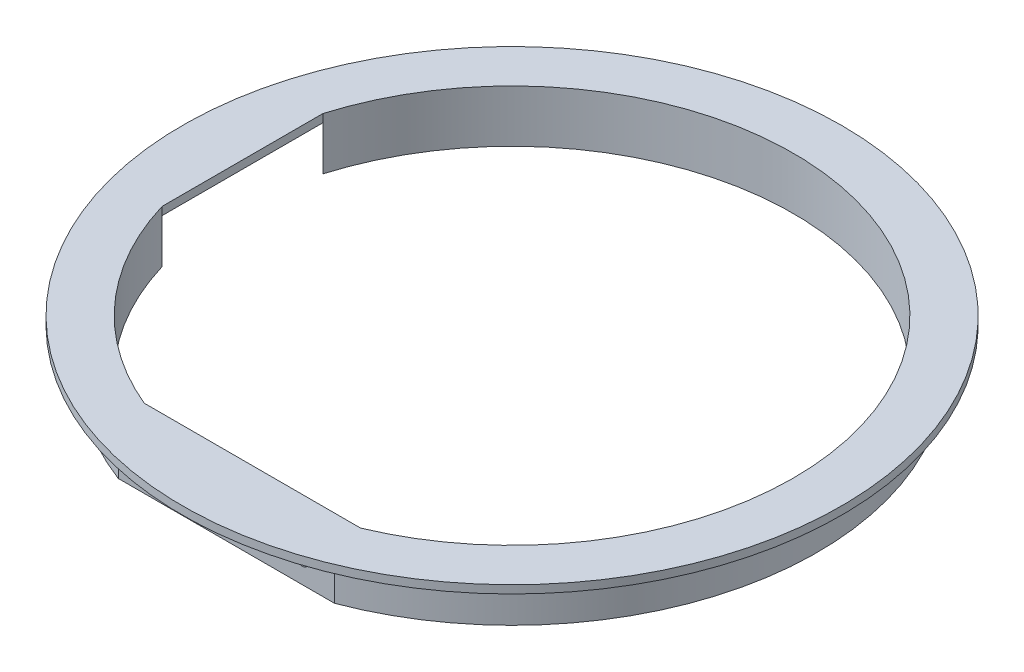
ISO-10303-21;
HEADER;
FILE_DESCRIPTION(('STEP AP214'),'2;1');
FILE_NAME('part.step','',(''),(''),'','','');
FILE_SCHEMA(('AUTOMOTIVE_DESIGN { 1 0 10303 214 1 1 1 1 }'));
ENDSEC;
DATA;
#1=APPLICATION_CONTEXT('core data for automotive mechanical design processes');
#2=APPLICATION_PROTOCOL_DEFINITION('international standard','automotive_design',2000,#1);
#3=PRODUCT_CONTEXT('',#1,'mechanical');
#4=PRODUCT('Part','Part','',(#3));
#5=PRODUCT_RELATED_PRODUCT_CATEGORY('part','',(#4));
#6=PRODUCT_DEFINITION_FORMATION('','',#4);
#7=PRODUCT_DEFINITION_CONTEXT('part definition',#1,'design');
#8=PRODUCT_DEFINITION('design','',#6,#7);
#9=PRODUCT_DEFINITION_SHAPE('','',#8);
#10=(LENGTH_UNIT() NAMED_UNIT(*) SI_UNIT(.MILLI.,.METRE.));
#11=(NAMED_UNIT(*) PLANE_ANGLE_UNIT() SI_UNIT($,.RADIAN.));
#12=(NAMED_UNIT(*) SI_UNIT($,.STERADIAN.) SOLID_ANGLE_UNIT());
#13=UNCERTAINTY_MEASURE_WITH_UNIT(LENGTH_MEASURE(1.E-05),#10,'distance_accuracy_value','');
#14=(GEOMETRIC_REPRESENTATION_CONTEXT(3) GLOBAL_UNCERTAINTY_ASSIGNED_CONTEXT((#13)) GLOBAL_UNIT_ASSIGNED_CONTEXT((#10,
#11,#12)) REPRESENTATION_CONTEXT('',''));
#15=CARTESIAN_POINT('',(0.,0.,0.));
#16=DIRECTION('',(0.,0.,1.));
#17=DIRECTION('',(1.,0.,0.));
#18=AXIS2_PLACEMENT_3D('',#15,#16,#17);
#19=CARTESIAN_POINT('',(-13.4536240470737,-0.999999999999997,35.5387112878337));
#20=DIRECTION('',(0.,0.,-1.));
#21=DIRECTION('',(-1.,0.,0.));
#22=AXIS2_PLACEMENT_3D('',#19,#20,#21);
#23=PLANE('',#22);
#24=CARTESIAN_POINT('',(9.45362404707372,-3.75,35.5387112878337));
#25=DIRECTION('',(0.,0.,1.));
#26=DIRECTION('',(1.,0.,0.));
#27=AXIS2_PLACEMENT_3D('',#24,#25,#26);
#28=CIRCLE('',#27,0.749999999999987);
#29=CARTESIAN_POINT('',(10.2036240470737,-3.75,35.5387112878337));
#30=VERTEX_POINT('',#29);
#31=EDGE_CURVE('E233',#30,#30,#28,.T.);
#32=ORIENTED_EDGE('',*,*,#31,.F.);
#33=EDGE_LOOP('',(#32));
#34=FACE_BOUND('',#33,.T.);
#35=CARTESIAN_POINT('',(5.45362404707372,-3.75,35.5387112878337));
#36=DIRECTION('',(0.,0.,1.));
#37=DIRECTION('',(1.,0.,0.));
#38=AXIS2_PLACEMENT_3D('',#35,#36,#37);
#39=CIRCLE('',#38,0.749999999999987);
#40=CARTESIAN_POINT('',(6.20362404707371,-3.75,35.5387112878337));
#41=VERTEX_POINT('',#40);
#42=EDGE_CURVE('E239',#41,#41,#39,.T.);
#43=ORIENTED_EDGE('',*,*,#42,.F.);
#44=EDGE_LOOP('',(#43));
#45=FACE_BOUND('',#44,.T.);
#46=CARTESIAN_POINT('',(-5.45362404707373,-3.75,35.5387112878337));
#47=DIRECTION('',(0.,0.,1.));
#48=DIRECTION('',(1.,0.,0.));
#49=AXIS2_PLACEMENT_3D('',#46,#47,#48);
#50=CIRCLE('',#49,0.749999999999987);
#51=CARTESIAN_POINT('',(-4.70362404707375,-3.75,35.5387112878337));
#52=VERTEX_POINT('',#51);
#53=EDGE_CURVE('E245',#52,#52,#50,.T.);
#54=ORIENTED_EDGE('',*,*,#53,.F.);
#55=EDGE_LOOP('',(#54));
#56=FACE_BOUND('',#55,.T.);
#57=DIRECTION('',(0.,-1.,0.));
#58=VECTOR('',#57,1.);
#59=CARTESIAN_POINT('',(13.4536240470737,-0.999999999999997,35.5387112878337));
#60=LINE('',#59,#58);
#61=CARTESIAN_POINT('',(13.4536240470737,-2.,35.5387112878337));
#62=VERTEX_POINT('',#61);
#63=CARTESIAN_POINT('',(13.4536240470737,-6.5,35.5387112878337));
#64=VERTEX_POINT('',#63);
#65=EDGE_CURVE('E156',#62,#64,#60,.T.);
#66=ORIENTED_EDGE('',*,*,#65,.F.);
#67=DIRECTION('',(1.,0.,0.));
#68=VECTOR('',#67,1.);
#69=CARTESIAN_POINT('',(-13.4536240470737,-2.,35.5387112878337));
#70=LINE('',#69,#68);
#71=CARTESIAN_POINT('',(-13.4536240470737,-2.,35.5387112878337));
#72=VERTEX_POINT('',#71);
#73=EDGE_CURVE('E188',#62,#72,#70,.F.);
#74=ORIENTED_EDGE('',*,*,#73,.T.);
#75=DIRECTION('',(0.,-1.,0.));
#76=VECTOR('',#75,1.);
#77=CARTESIAN_POINT('',(-13.4536240470737,-0.999999999999997,35.5387112878337));
#78=LINE('',#77,#76);
#79=CARTESIAN_POINT('',(-13.4536240470737,-6.5,35.5387112878337));
#80=VERTEX_POINT('',#79);
#81=EDGE_CURVE('E269',#72,#80,#78,.T.);
#82=ORIENTED_EDGE('',*,*,#81,.T.);
#83=DIRECTION('',(1.,0.,0.));
#84=VECTOR('',#83,1.);
#85=CARTESIAN_POINT('',(-13.4536240470737,-6.5,35.5387112878337));
#86=LINE('',#85,#84);
#87=EDGE_CURVE('E266',#80,#64,#86,.T.);
#88=ORIENTED_EDGE('',*,*,#87,.T.);
#89=EDGE_LOOP('',(#66,#74,#82,#88));
#90=FACE_BOUND('',#89,.T.);
#91=CARTESIAN_POINT('',(-9.45362404707373,-3.75,35.5387112878337));
#92=DIRECTION('',(0.,0.,1.));
#93=DIRECTION('',(1.,0.,0.));
#94=AXIS2_PLACEMENT_3D('',#91,#92,#93);
#95=CIRCLE('',#94,0.749999999999987);
#96=CARTESIAN_POINT('',(-8.70362404707375,-3.75,35.5387112878337));
#97=VERTEX_POINT('',#96);
#98=EDGE_CURVE('E251',#97,#97,#95,.T.);
#99=ORIENTED_EDGE('',*,*,#98,.F.);
#100=EDGE_LOOP('',(#99));
#101=FACE_BOUND('',#100,.T.);
#102=ADVANCED_FACE('F33',(#34,#45,#56,#90,#101),#23,.F.);
#103=CARTESIAN_POINT('',(0.,-6.5,0.));
#104=DIRECTION('',(0.,-1.,0.));
#105=DIRECTION('',(0.,0.,-1.));
#106=AXIS2_PLACEMENT_3D('',#103,#104,#105);
#107=CYLINDRICAL_SURFACE('',#106,38.);
#108=ORIENTED_EDGE('',*,*,#81,.F.);
#109=CARTESIAN_POINT('',(0.,-2.,0.));
#110=DIRECTION('',(0.,-1.,0.));
#111=DIRECTION('',(0.,0.,-1.));
#112=AXIS2_PLACEMENT_3D('',#109,#110,#111);
#113=CIRCLE('',#112,38.);
#114=CARTESIAN_POINT('',(-36.6606055596467,-2.,10.));
#115=VERTEX_POINT('',#114);
#116=EDGE_CURVE('E178',#72,#115,#113,.T.);
#117=ORIENTED_EDGE('',*,*,#116,.T.);
#118=DIRECTION('',(0.,-1.,0.));
#119=VECTOR('',#118,1.);
#120=CARTESIAN_POINT('',(-36.6606055596467,-0.999999999999997,10.));
#121=LINE('',#120,#119);
#122=CARTESIAN_POINT('',(-36.6606055596467,-6.5,10.));
#123=VERTEX_POINT('',#122);
#124=EDGE_CURVE('E264',#115,#123,#121,.T.);
#125=ORIENTED_EDGE('',*,*,#124,.T.);
#126=CARTESIAN_POINT('',(0.,-6.5,0.));
#127=DIRECTION('',(0.,-1.,0.));
#128=DIRECTION('',(0.,0.,-1.));
#129=AXIS2_PLACEMENT_3D('',#126,#127,#128);
#130=CIRCLE('',#129,38.);
#131=EDGE_CURVE('E169',#80,#123,#130,.T.);
#132=ORIENTED_EDGE('',*,*,#131,.F.);
#133=EDGE_LOOP('',(#108,#117,#125,#132));
#134=FACE_BOUND('',#133,.T.);
#135=ADVANCED_FACE('F294',(#134),#107,.T.);
#136=CARTESIAN_POINT('',(0.,0.,0.));
#137=DIRECTION('',(0.,1.,0.));
#138=DIRECTION('',(0.,0.,1.));
#139=AXIS2_PLACEMENT_3D('',#136,#137,#138);
#140=PLANE('',#139);
#141=CARTESIAN_POINT('',(0.,0.,0.));
#142=DIRECTION('',(0.,1.,0.));
#143=DIRECTION('',(0.,0.,1.));
#144=AXIS2_PLACEMENT_3D('',#141,#142,#143);
#145=CIRCLE('',#144,35.);
#146=CARTESIAN_POINT('',(-33.5410196624969,0.,10.));
#147=VERTEX_POINT('',#146);
#148=CARTESIAN_POINT('',(-13.4536240470737,0.,32.310988842807));
#149=VERTEX_POINT('',#148);
#150=EDGE_CURVE('E153',#147,#149,#145,.T.);
#151=ORIENTED_EDGE('',*,*,#150,.F.);
#152=DIRECTION('',(0.,0.,1.));
#153=VECTOR('',#152,1.);
#154=CARTESIAN_POINT('',(-33.5410196624969,0.,-10.));
#155=LINE('',#154,#153);
#156=CARTESIAN_POINT('',(-33.5410196624969,0.,-10.));
#157=VERTEX_POINT('',#156);
#158=EDGE_CURVE('E161',#157,#147,#155,.T.);
#159=ORIENTED_EDGE('',*,*,#158,.F.);
#160=CARTESIAN_POINT('',(0.,0.,0.));
#161=DIRECTION('',(0.,1.,0.));
#162=DIRECTION('',(0.,0.,1.));
#163=AXIS2_PLACEMENT_3D('',#160,#161,#162);
#164=CIRCLE('',#163,35.);
#165=CARTESIAN_POINT('',(13.4536240470737,0.,32.310988842807));
#166=VERTEX_POINT('',#165);
#167=EDGE_CURVE('E159',#166,#157,#164,.T.);
#168=ORIENTED_EDGE('',*,*,#167,.F.);
#169=DIRECTION('',(1.,0.,0.));
#170=VECTOR('',#169,1.);
#171=CARTESIAN_POINT('',(-13.4536240470737,0.,32.310988842807));
#172=LINE('',#171,#170);
#173=EDGE_CURVE('E155',#149,#166,#172,.T.);
#174=ORIENTED_EDGE('',*,*,#173,.F.);
#175=EDGE_LOOP('',(#151,#159,#168,#174));
#176=FACE_BOUND('',#175,.T.);
#177=CARTESIAN_POINT('',(0.,0.,0.));
#178=DIRECTION('',(0.,-1.,0.));
#179=DIRECTION('',(0.,0.,-1.));
#180=AXIS2_PLACEMENT_3D('',#177,#178,#179);
#181=CIRCLE('',#180,41.);
#182=CARTESIAN_POINT('',(0.,0.,-41.));
#183=VERTEX_POINT('',#182);
#184=EDGE_CURVE('E175',#183,#183,#181,.T.);
#185=ORIENTED_EDGE('',*,*,#184,.F.);
#186=EDGE_LOOP('',(#185));
#187=FACE_BOUND('',#186,.T.);
#188=ADVANCED_FACE('F211',(#176,#187),#140,.T.);
#189=CARTESIAN_POINT('',(0.,-6.5,0.));
#190=DIRECTION('',(0.,-1.,0.));
#191=DIRECTION('',(0.,0.,-1.));
#192=AXIS2_PLACEMENT_3D('',#189,#190,#191);
#193=CYLINDRICAL_SURFACE('',#192,41.);
#194=ORIENTED_EDGE('',*,*,#184,.T.);
#195=EDGE_LOOP('',(#194));
#196=FACE_BOUND('',#195,.T.);
#197=CARTESIAN_POINT('',(0.,-1.,0.));
#198=DIRECTION('',(0.,-1.,0.));
#199=DIRECTION('',(0.,0.,-1.));
#200=AXIS2_PLACEMENT_3D('',#197,#198,#199);
#201=CIRCLE('',#200,41.);
#202=CARTESIAN_POINT('',(0.,-1.,-41.));
#203=VERTEX_POINT('',#202);
#204=EDGE_CURVE('E172',#203,#203,#201,.T.);
#205=ORIENTED_EDGE('',*,*,#204,.F.);
#206=EDGE_LOOP('',(#205));
#207=FACE_BOUND('',#206,.T.);
#208=ADVANCED_FACE('F330',(#196,#207),#193,.T.);
#209=CARTESIAN_POINT('',(0.,-1.,-41.));
#210=DIRECTION('',(0.,-1.,0.));
#211=DIRECTION('',(0.,0.,-1.));
#212=AXIS2_PLACEMENT_3D('',#209,#210,#211);
#213=PLANE('',#212);
#214=DIRECTION('',(-1.,0.,0.));
#215=VECTOR('',#214,1.);
#216=CARTESIAN_POINT('',(-26.6606055596467,-0.999999999999997,10.));
#217=LINE('',#216,#215);
#218=CARTESIAN_POINT('',(-33.5410196624969,-0.999999999999997,10.));
#219=VERTEX_POINT('',#218);
#220=CARTESIAN_POINT('',(-37.6961536499415,-1.,10.));
#221=VERTEX_POINT('',#220);
#222=EDGE_CURVE('E257',#219,#221,#217,.T.);
#223=ORIENTED_EDGE('',*,*,#222,.T.);
#224=CARTESIAN_POINT('',(0.,-1.,0.));
#225=DIRECTION('',(0.,-1.,0.));
#226=DIRECTION('',(0.,0.,-1.));
#227=AXIS2_PLACEMENT_3D('',#224,#225,#226);
#228=CIRCLE('',#227,39.);
#229=CARTESIAN_POINT('',(-13.6353429522082,-1.,36.5387112878337));
#230=VERTEX_POINT('',#229);
#231=EDGE_CURVE('E186',#221,#230,#228,.F.);
#232=ORIENTED_EDGE('',*,*,#231,.T.);
#233=DIRECTION('',(1.,0.,0.));
#234=VECTOR('',#233,1.);
#235=CARTESIAN_POINT('',(0.,-1.,36.5387112878337));
#236=LINE('',#235,#234);
#237=CARTESIAN_POINT('',(13.6353429522082,-1.,36.5387112878337));
#238=VERTEX_POINT('',#237);
#239=EDGE_CURVE('E184',#230,#238,#236,.T.);
#240=ORIENTED_EDGE('',*,*,#239,.T.);
#241=CARTESIAN_POINT('',(0.,-1.,0.));
#242=DIRECTION('',(0.,-1.,0.));
#243=DIRECTION('',(0.,0.,-1.));
#244=AXIS2_PLACEMENT_3D('',#241,#242,#243);
#245=CIRCLE('',#244,39.);
#246=CARTESIAN_POINT('',(-33.5410196624969,-0.999999999999997,-19.8997487421324));
#247=VERTEX_POINT('',#246);
#248=EDGE_CURVE('E181',#238,#247,#245,.F.);
#249=ORIENTED_EDGE('',*,*,#248,.T.);
#250=DIRECTION('',(0.,0.,1.));
#251=VECTOR('',#250,1.);
#252=CARTESIAN_POINT('',(-33.5410196624969,-0.999999999999997,-41.));
#253=LINE('',#252,#251);
#254=CARTESIAN_POINT('',(-33.5410196624969,-0.999999999999997,-10.));
#255=VERTEX_POINT('',#254);
#256=EDGE_CURVE('E128',#247,#255,#253,.T.);
#257=ORIENTED_EDGE('',*,*,#256,.T.);
#258=DIRECTION('',(0.,0.,-1.));
#259=VECTOR('',#258,1.);
#260=CARTESIAN_POINT('',(-33.5410196624969,-0.999999999999997,-10.));
#261=LINE('',#260,#259);
#262=EDGE_CURVE('E261',#219,#255,#261,.T.);
#263=ORIENTED_EDGE('',*,*,#262,.F.);
#264=EDGE_LOOP('',(#223,#232,#240,#249,#257,#263));
#265=FACE_BOUND('',#264,.T.);
#266=ORIENTED_EDGE('',*,*,#204,.T.);
#267=EDGE_LOOP('',(#266));
#268=FACE_BOUND('',#267,.T.);
#269=ADVANCED_FACE('F287',(#265,#268),#213,.T.);
#270=DIRECTION('',(0.,-1.,0.));
#271=VECTOR('',#270,1.);
#272=CARTESIAN_POINT('',(-33.5410196624969,-6.5,-17.8605710994917));
#273=LINE('',#272,#271);
#274=CARTESIAN_POINT('',(-33.5410196624969,-2.,-17.8605710994917));
#275=VERTEX_POINT('',#274);
#276=CARTESIAN_POINT('',(-33.5410196624969,-6.5,-17.8605710994917));
#277=VERTEX_POINT('',#276);
#278=EDGE_CURVE('E123',#275,#277,#273,.T.);
#279=ORIENTED_EDGE('',*,*,#278,.F.);
#280=CARTESIAN_POINT('',(0.,-2.,0.));
#281=DIRECTION('',(0.,-1.,0.));
#282=DIRECTION('',(0.,0.,-1.));
#283=AXIS2_PLACEMENT_3D('',#280,#281,#282);
#284=CIRCLE('',#283,38.);
#285=EDGE_CURVE('E59',#275,#62,#284,.T.);
#286=ORIENTED_EDGE('',*,*,#285,.T.);
#287=ORIENTED_EDGE('',*,*,#65,.T.);
#288=EDGE_CURVE('E166',#277,#64,#130,.T.);
#289=ORIENTED_EDGE('',*,*,#288,.F.);
#290=EDGE_LOOP('',(#279,#286,#287,#289));
#291=FACE_BOUND('',#290,.T.);
#292=ADVANCED_FACE('F299',(#291),#107,.T.);
#293=CARTESIAN_POINT('',(0.,-6.5,-38.));
#294=DIRECTION('',(0.,-1.,0.));
#295=DIRECTION('',(0.,0.,-1.));
#296=AXIS2_PLACEMENT_3D('',#293,#294,#295);
#297=PLANE('',#296);
#298=DIRECTION('',(0.,0.,1.));
#299=VECTOR('',#298,1.);
#300=CARTESIAN_POINT('',(-33.5410196624969,-6.5,-41.));
#301=LINE('',#300,#299);
#302=CARTESIAN_POINT('',(-33.5410196624969,-6.5,-10.));
#303=VERTEX_POINT('',#302);
#304=EDGE_CURVE('E118',#277,#303,#301,.T.);
#305=ORIENTED_EDGE('',*,*,#304,.F.);
#306=ORIENTED_EDGE('',*,*,#288,.T.);
#307=ORIENTED_EDGE('',*,*,#87,.F.);
#308=ORIENTED_EDGE('',*,*,#131,.T.);
#309=DIRECTION('',(-1.,0.,0.));
#310=VECTOR('',#309,1.);
#311=CARTESIAN_POINT('',(-26.6606055596467,-6.5,10.));
#312=LINE('',#311,#310);
#313=CARTESIAN_POINT('',(-33.5410196624969,-6.5,10.));
#314=VERTEX_POINT('',#313);
#315=EDGE_CURVE('E258',#314,#123,#312,.T.);
#316=ORIENTED_EDGE('',*,*,#315,.F.);
#317=CARTESIAN_POINT('',(0.,-6.5,0.));
#318=DIRECTION('',(0.,1.,0.));
#319=DIRECTION('',(0.,0.,1.));
#320=AXIS2_PLACEMENT_3D('',#317,#318,#319);
#321=CIRCLE('',#320,35.);
#322=CARTESIAN_POINT('',(-13.4536240470737,-6.5,32.310988842807));
#323=VERTEX_POINT('',#322);
#324=EDGE_CURVE('E149',#314,#323,#321,.T.);
#325=ORIENTED_EDGE('',*,*,#324,.T.);
#326=DIRECTION('',(1.,0.,0.));
#327=VECTOR('',#326,1.);
#328=CARTESIAN_POINT('',(-13.4536240470737,-6.5,32.310988842807));
#329=LINE('',#328,#327);
#330=CARTESIAN_POINT('',(13.4536240470737,-6.5,32.310988842807));
#331=VERTEX_POINT('',#330);
#332=EDGE_CURVE('E143',#323,#331,#329,.T.);
#333=ORIENTED_EDGE('',*,*,#332,.T.);
#334=CARTESIAN_POINT('',(0.,-6.5,0.));
#335=DIRECTION('',(0.,1.,0.));
#336=DIRECTION('',(0.,0.,1.));
#337=AXIS2_PLACEMENT_3D('',#334,#335,#336);
#338=CIRCLE('',#337,35.);
#339=EDGE_CURVE('E134',#331,#303,#338,.T.);
#340=ORIENTED_EDGE('',*,*,#339,.T.);
#341=EDGE_LOOP('',(#305,#306,#307,#308,#316,#325,#333,#340));
#342=FACE_BOUND('',#341,.T.);
#343=ADVANCED_FACE('F140',(#342),#297,.T.);
#344=CARTESIAN_POINT('',(0.,-6.5,0.));
#345=DIRECTION('',(0.,1.,0.));
#346=DIRECTION('',(0.,0.,1.));
#347=AXIS2_PLACEMENT_3D('',#344,#345,#346);
#348=CYLINDRICAL_SURFACE('',#347,35.);
#349=ORIENTED_EDGE('',*,*,#150,.T.);
#350=DIRECTION('',(0.,1.,0.));
#351=VECTOR('',#350,1.);
#352=CARTESIAN_POINT('',(-13.4536240470737,-6.5,32.310988842807));
#353=LINE('',#352,#351);
#354=EDGE_CURVE('E144',#323,#149,#353,.T.);
#355=ORIENTED_EDGE('',*,*,#354,.F.);
#356=ORIENTED_EDGE('',*,*,#324,.F.);
#357=DIRECTION('',(0.,1.,0.));
#358=VECTOR('',#357,1.);
#359=CARTESIAN_POINT('',(-33.5410196624969,-6.5,10.));
#360=LINE('',#359,#358);
#361=EDGE_CURVE('E164',#314,#219,#360,.T.);
#362=ORIENTED_EDGE('',*,*,#361,.T.);
#363=EDGE_CURVE('E137',#219,#147,#360,.T.);
#364=ORIENTED_EDGE('',*,*,#363,.T.);
#365=EDGE_LOOP('',(#349,#355,#356,#362,#364));
#366=FACE_BOUND('',#365,.T.);
#367=ADVANCED_FACE('F274',(#366),#348,.F.);
#368=CARTESIAN_POINT('',(-33.5410196624969,-6.5,-10.));
#369=DIRECTION('',(-1.,0.,0.));
#370=DIRECTION('',(0.,0.,1.));
#371=AXIS2_PLACEMENT_3D('',#368,#369,#370);
#372=PLANE('',#371);
#373=ORIENTED_EDGE('',*,*,#363,.F.);
#374=ORIENTED_EDGE('',*,*,#262,.T.);
#375=DIRECTION('',(0.,1.,0.));
#376=VECTOR('',#375,1.);
#377=CARTESIAN_POINT('',(-33.5410196624969,-6.5,-10.));
#378=LINE('',#377,#376);
#379=EDGE_CURVE('E136',#255,#157,#378,.T.);
#380=ORIENTED_EDGE('',*,*,#379,.T.);
#381=ORIENTED_EDGE('',*,*,#158,.T.);
#382=EDGE_LOOP('',(#373,#374,#380,#381));
#383=FACE_BOUND('',#382,.T.);
#384=ADVANCED_FACE('F285',(#383),#372,.F.);
#385=CARTESIAN_POINT('',(0.,-6.5,0.));
#386=DIRECTION('',(0.,1.,0.));
#387=DIRECTION('',(0.,0.,1.));
#388=AXIS2_PLACEMENT_3D('',#385,#386,#387);
#389=CYLINDRICAL_SURFACE('',#388,35.);
#390=ORIENTED_EDGE('',*,*,#167,.T.);
#391=ORIENTED_EDGE('',*,*,#379,.F.);
#392=EDGE_CURVE('E121',#303,#255,#378,.T.);
#393=ORIENTED_EDGE('',*,*,#392,.F.);
#394=ORIENTED_EDGE('',*,*,#339,.F.);
#395=DIRECTION('',(0.,1.,0.));
#396=VECTOR('',#395,1.);
#397=CARTESIAN_POINT('',(13.4536240470737,-6.5,32.310988842807));
#398=LINE('',#397,#396);
#399=EDGE_CURVE('E147',#331,#166,#398,.T.);
#400=ORIENTED_EDGE('',*,*,#399,.T.);
#401=EDGE_LOOP('',(#390,#391,#393,#394,#400));
#402=FACE_BOUND('',#401,.T.);
#403=ADVANCED_FACE('F133',(#402),#389,.F.);
#404=CARTESIAN_POINT('',(-13.4536240470737,-6.5,32.310988842807));
#405=DIRECTION('',(0.,0.,1.));
#406=DIRECTION('',(1.,0.,0.));
#407=AXIS2_PLACEMENT_3D('',#404,#405,#406);
#408=PLANE('',#407);
#409=CARTESIAN_POINT('',(9.45362404707372,-3.75,32.310988842807));
#410=DIRECTION('',(0.,0.,1.));
#411=DIRECTION('',(1.,0.,0.));
#412=AXIS2_PLACEMENT_3D('',#409,#410,#411);
#413=CIRCLE('',#412,0.749999999999993);
#414=CARTESIAN_POINT('',(10.2036240470737,-3.75,32.310988842807));
#415=VERTEX_POINT('',#414);
#416=EDGE_CURVE('E236',#415,#415,#413,.T.);
#417=ORIENTED_EDGE('',*,*,#416,.T.);
#418=EDGE_LOOP('',(#417));
#419=FACE_BOUND('',#418,.T.);
#420=CARTESIAN_POINT('',(5.45362404707372,-3.75,32.310988842807));
#421=DIRECTION('',(0.,0.,1.));
#422=DIRECTION('',(1.,0.,0.));
#423=AXIS2_PLACEMENT_3D('',#420,#421,#422);
#424=CIRCLE('',#423,0.749999999999993);
#425=CARTESIAN_POINT('',(6.20362404707372,-3.75,32.310988842807));
#426=VERTEX_POINT('',#425);
#427=EDGE_CURVE('E242',#426,#426,#424,.T.);
#428=ORIENTED_EDGE('',*,*,#427,.T.);
#429=EDGE_LOOP('',(#428));
#430=FACE_BOUND('',#429,.T.);
#431=CARTESIAN_POINT('',(-5.45362404707373,-3.75,32.310988842807));
#432=DIRECTION('',(0.,0.,1.));
#433=DIRECTION('',(1.,0.,0.));
#434=AXIS2_PLACEMENT_3D('',#431,#432,#433);
#435=CIRCLE('',#434,0.749999999999993);
#436=CARTESIAN_POINT('',(-4.70362404707374,-3.75,32.310988842807));
#437=VERTEX_POINT('',#436);
#438=EDGE_CURVE('E248',#437,#437,#435,.T.);
#439=ORIENTED_EDGE('',*,*,#438,.T.);
#440=EDGE_LOOP('',(#439));
#441=FACE_BOUND('',#440,.T.);
#442=CARTESIAN_POINT('',(-9.45362404707373,-3.75,32.310988842807));
#443=DIRECTION('',(0.,0.,1.));
#444=DIRECTION('',(1.,0.,0.));
#445=AXIS2_PLACEMENT_3D('',#442,#443,#444);
#446=CIRCLE('',#445,0.749999999999993);
#447=CARTESIAN_POINT('',(-8.70362404707374,-3.75,32.310988842807));
#448=VERTEX_POINT('',#447);
#449=EDGE_CURVE('E254',#448,#448,#446,.T.);
#450=ORIENTED_EDGE('',*,*,#449,.T.);
#451=EDGE_LOOP('',(#450));
#452=FACE_BOUND('',#451,.T.);
#453=ORIENTED_EDGE('',*,*,#173,.T.);
#454=ORIENTED_EDGE('',*,*,#399,.F.);
#455=ORIENTED_EDGE('',*,*,#332,.F.);
#456=ORIENTED_EDGE('',*,*,#354,.T.);
#457=EDGE_LOOP('',(#453,#454,#455,#456));
#458=FACE_BOUND('',#457,.T.);
#459=ADVANCED_FACE('F278',(#419,#430,#441,#452,#458),#408,.F.);
#460=CARTESIAN_POINT('',(-26.6606055596467,-6.5,10.));
#461=DIRECTION('',(0.,0.,1.));
#462=DIRECTION('',(1.,0.,0.));
#463=AXIS2_PLACEMENT_3D('',#460,#461,#462);
#464=PLANE('',#463);
#465=ORIENTED_EDGE('',*,*,#315,.T.);
#466=ORIENTED_EDGE('',*,*,#124,.F.);
#467=CARTESIAN_POINT('',(-36.6606055596467,-2.,10.));
#468=CARTESIAN_POINT('',(-36.6606052085271,-1.97257758565101,10.));
#469=CARTESIAN_POINT('',(-36.6617755311309,-1.94516857611069,10.));
#470=CARTESIAN_POINT('',(-36.6664407964384,-1.89055242029397,10.));
#471=CARTESIAN_POINT('',(-36.6699354585329,-1.8633452500511,10.));
#472=CARTESIAN_POINT('',(-36.6838568442147,-1.78242119554099,10.));
#473=CARTESIAN_POINT('',(-36.6977211717125,-1.72925574273077,10.));
#474=CARTESIAN_POINT('',(-36.7341506278764,-1.62602404498493,10.));
#475=CARTESIAN_POINT('',(-36.7567168590644,-1.57595819369869,10.));
#476=CARTESIAN_POINT('',(-36.8098116561231,-1.48023782233807,10.));
#477=CARTESIAN_POINT('',(-36.8403410878664,-1.43458378271897,10.));
#478=CARTESIAN_POINT('',(-36.908936249674,-1.34819575180145,10.));
#479=CARTESIAN_POINT('',(-36.9471104606585,-1.30754803285531,10.));
#480=CARTESIAN_POINT('',(-37.0295499696493,-1.23298118591134,10.));
#481=CARTESIAN_POINT('',(-37.0738167684356,-1.19906372081118,10.));
#482=CARTESIAN_POINT('',(-37.1687512197938,-1.1377259526537,10.));
#483=CARTESIAN_POINT('',(-37.2195831230641,-1.11056009628204,10.));
#484=CARTESIAN_POINT('',(-37.3249863456477,-1.06486015989163,10.));
#485=CARTESIAN_POINT('',(-37.3795572003587,-1.0463250096441,10.));
#486=CARTESIAN_POINT('',(-37.4778777859281,-1.02157378233186,10.));
#487=CARTESIAN_POINT('',(-37.5211680002068,-1.01348906874016,10.));
#488=CARTESIAN_POINT('',(-37.6083526634851,-1.00270190971819,10.));
#489=CARTESIAN_POINT('',(-37.6522461869446,-0.999991983667516,10.));
#490=CARTESIAN_POINT('',(-37.6961536499415,-1.,10.));
#491=B_SPLINE_CURVE_WITH_KNOTS('',3,(#467,#468,#469,#470,#471,#472,#473,#474,#475,#476,#477,
#478,#479,#480,#481,#482,#483,#484,#485,#486,#487,#488,#489,#490),.UNSPECIFIED.,.F.,.F.,(4,2,2,
2,2,2,2,2,2,2,2,4),(0.,0.0822157998531311,0.164421675890296,0.328401027487348,0.492401161921324,
0.65641913622435,0.822954591621681,0.989531143171274,1.16166383212375,1.33377517051158,
1.4655706544237,1.59718257651714),.UNSPECIFIED.);
#492=EDGE_CURVE('E46',#115,#221,#491,.T.);
#493=ORIENTED_EDGE('',*,*,#492,.T.);
#494=ORIENTED_EDGE('',*,*,#222,.F.);
#495=ORIENTED_EDGE('',*,*,#361,.F.);
#496=EDGE_LOOP('',(#465,#466,#493,#494,#495));
#497=FACE_BOUND('',#496,.T.);
#498=ADVANCED_FACE('F201',(#497),#464,.F.);
#499=CARTESIAN_POINT('',(-9.45362404707373,-3.75,35.5387112878337));
#500=DIRECTION('',(0.,0.,1.));
#501=DIRECTION('',(1.,0.,0.));
#502=AXIS2_PLACEMENT_3D('',#499,#500,#501);
#503=CYLINDRICAL_SURFACE('',#502,0.749999999999993);
#504=ORIENTED_EDGE('',*,*,#449,.F.);
#505=EDGE_LOOP('',(#504));
#506=FACE_BOUND('',#505,.T.);
#507=ORIENTED_EDGE('',*,*,#98,.T.);
#508=EDGE_LOOP('',(#507));
#509=FACE_BOUND('',#508,.T.);
#510=ADVANCED_FACE('F363',(#506,#509),#503,.F.);
#511=CARTESIAN_POINT('',(-5.45362404707373,-3.75,35.5387112878337));
#512=DIRECTION('',(0.,0.,1.));
#513=DIRECTION('',(1.,0.,0.));
#514=AXIS2_PLACEMENT_3D('',#511,#512,#513);
#515=CYLINDRICAL_SURFACE('',#514,0.749999999999993);
#516=ORIENTED_EDGE('',*,*,#438,.F.);
#517=EDGE_LOOP('',(#516));
#518=FACE_BOUND('',#517,.T.);
#519=ORIENTED_EDGE('',*,*,#53,.T.);
#520=EDGE_LOOP('',(#519));
#521=FACE_BOUND('',#520,.T.);
#522=ADVANCED_FACE('F369',(#518,#521),#515,.F.);
#523=CARTESIAN_POINT('',(5.45362404707372,-3.75,35.5387112878337));
#524=DIRECTION('',(0.,0.,1.));
#525=DIRECTION('',(1.,0.,0.));
#526=AXIS2_PLACEMENT_3D('',#523,#524,#525);
#527=CYLINDRICAL_SURFACE('',#526,0.749999999999993);
#528=ORIENTED_EDGE('',*,*,#427,.F.);
#529=EDGE_LOOP('',(#528));
#530=FACE_BOUND('',#529,.T.);
#531=ORIENTED_EDGE('',*,*,#42,.T.);
#532=EDGE_LOOP('',(#531));
#533=FACE_BOUND('',#532,.T.);
#534=ADVANCED_FACE('F378',(#530,#533),#527,.F.);
#535=CARTESIAN_POINT('',(9.45362404707372,-3.75,35.5387112878337));
#536=DIRECTION('',(0.,0.,1.));
#537=DIRECTION('',(1.,0.,0.));
#538=AXIS2_PLACEMENT_3D('',#535,#536,#537);
#539=CYLINDRICAL_SURFACE('',#538,0.749999999999993);
#540=ORIENTED_EDGE('',*,*,#416,.F.);
#541=EDGE_LOOP('',(#540));
#542=FACE_BOUND('',#541,.T.);
#543=ORIENTED_EDGE('',*,*,#31,.T.);
#544=EDGE_LOOP('',(#543));
#545=FACE_BOUND('',#544,.T.);
#546=ADVANCED_FACE('F306',(#542,#545),#539,.F.);
#547=CARTESIAN_POINT('',(-33.5410196624969,-6.5,-41.));
#548=DIRECTION('',(1.,0.,0.));
#549=DIRECTION('',(0.,0.,-1.));
#550=AXIS2_PLACEMENT_3D('',#547,#548,#549);
#551=PLANE('',#550);
#552=ORIENTED_EDGE('',*,*,#256,.F.);
#553=CARTESIAN_POINT('',(-33.5410196624969,-1.,-19.8997487421324));
#554=CARTESIAN_POINT('',(-33.5410196624969,-1.0000335947938,-19.8152188526145));
#555=CARTESIAN_POINT('',(-33.5410196624969,-1.00279228162724,-19.7306829934714));
#556=CARTESIAN_POINT('',(-33.5410196624969,-1.01384762324354,-19.5618530531815));
#557=CARTESIAN_POINT('',(-33.5410196624969,-1.02215224473913,-19.4775594952918));
#558=CARTESIAN_POINT('',(-33.5410196624969,-1.04431749128288,-19.3102427482217));
#559=CARTESIAN_POINT('',(-33.5410196624969,-1.05814274225565,-19.2272148998021));
#560=CARTESIAN_POINT('',(-33.5410196624969,-1.09167933179017,-19.0624011658653));
#561=CARTESIAN_POINT('',(-33.5410196624969,-1.11138629436165,-18.980614404353));
#562=CARTESIAN_POINT('',(-33.5410196624969,-1.15373620708816,-18.83145543994));
#563=CARTESIAN_POINT('',(-33.5410196624969,-1.17544634414685,-18.7638190908668));
#564=CARTESIAN_POINT('',(-33.5410196624969,-1.2242353596835,-18.6301002073128));
#565=CARTESIAN_POINT('',(-33.5410196624969,-1.25133950098727,-18.5640266865244));
#566=CARTESIAN_POINT('',(-33.5410196624969,-1.30124808291977,-18.4573017001179));
#567=CARTESIAN_POINT('',(-33.5410196624969,-1.32226108451433,-18.4158126352255));
#568=CARTESIAN_POINT('',(-33.5410196624969,-1.36732761244757,-18.3344560192068));
#569=CARTESIAN_POINT('',(-33.5410196624969,-1.39138349155329,-18.294589754707));
#570=CARTESIAN_POINT('',(-33.5410196624969,-1.44282175211719,-18.2174170014779));
#571=CARTESIAN_POINT('',(-33.5410196624969,-1.47018121874422,-18.1800954039189));
#572=CARTESIAN_POINT('',(-33.5410196624969,-1.52888628123556,-18.1087768193275));
#573=CARTESIAN_POINT('',(-33.5410196624969,-1.56022344031702,-18.0747730574986));
#574=CARTESIAN_POINT('',(-33.5410196624969,-1.6189008867244,-18.0197308954001));
#575=CARTESIAN_POINT('',(-33.5410196624969,-1.64520905006543,-17.9976024278609));
#576=CARTESIAN_POINT('',(-33.5410196624969,-1.70060041012923,-17.9570179720226));
#577=CARTESIAN_POINT('',(-33.5410196624969,-1.72968518197404,-17.9385640867863));
#578=CARTESIAN_POINT('',(-33.5410196624969,-1.79098146379854,-17.9064271896535));
#579=CARTESIAN_POINT('',(-33.5410196624969,-1.82323226881524,-17.8928174037014));
#580=CARTESIAN_POINT('',(-33.5410196624969,-1.88977413953111,-17.8723414294171));
#581=CARTESIAN_POINT('',(-33.5410196624969,-1.92405583013572,-17.8654464790884));
#582=CARTESIAN_POINT('',(-33.5410196624969,-1.96548599386302,-17.8617868565143));
#583=CARTESIAN_POINT('',(-33.5410196624969,-1.97238201390889,-17.861331342424));
#584=CARTESIAN_POINT('',(-33.5410196624969,-1.9861843836478,-17.8607240774197));
#585=CARTESIAN_POINT('',(-33.5410196624969,-1.99309072744209,-17.8605721925937));
#586=CARTESIAN_POINT('',(-33.5410196624969,-2.,-17.8605710994917));
#587=B_SPLINE_CURVE_WITH_KNOTS('',3,(#553,#554,#555,#556,#557,#558,#559,#560,#561,#562,#563,
#564,#565,#566,#567,#568,#569,#570,#571,#572,#573,#574,#575,#576,#577,#578,#579,#580,#581,#582,
#583,#584,#585,#586),.UNSPECIFIED.,.F.,.F.,(4,2,2,2,2,2,2,2,2,2,2,2,2,2,2,2,4),(0.,
0.253556408492819,0.50747783547586,0.759797689512565,1.01193028370342,1.22486327620938,
1.43881806106506,1.57823855793942,1.71776752199646,1.85637896332596,1.99470117108508,
2.09759440282515,2.20054635494601,2.30499437650327,2.40899301666652,2.42972247013188,
2.45044277910275),.UNSPECIFIED.);
#588=EDGE_CURVE('E11',#247,#275,#587,.T.);
#589=ORIENTED_EDGE('',*,*,#588,.T.);
#590=ORIENTED_EDGE('',*,*,#278,.T.);
#591=ORIENTED_EDGE('',*,*,#304,.T.);
#592=ORIENTED_EDGE('',*,*,#392,.T.);
#593=EDGE_LOOP('',(#552,#589,#590,#591,#592));
#594=FACE_BOUND('',#593,.T.);
#595=ADVANCED_FACE('F120',(#594),#551,.F.);
#596=CARTESIAN_POINT('',(0.,-2.,0.));
#597=DIRECTION('',(0.,-1.,0.));
#598=DIRECTION('',(0.,0.,-1.));
#599=AXIS2_PLACEMENT_3D('',#596,#597,#598);
#600=TOROIDAL_SURFACE('',#599,39.,1.);
#601=ORIENTED_EDGE('',*,*,#588,.F.);
#602=ORIENTED_EDGE('',*,*,#248,.F.);
#603=CARTESIAN_POINT('',(13.4536240470737,-2.,35.5387112878337));
#604=CARTESIAN_POINT('',(13.453624020579,-1.97219812349282,35.5387112323036));
#605=CARTESIAN_POINT('',(13.4538362963648,-1.94440968628451,35.5398714518823));
#606=CARTESIAN_POINT('',(13.4546827489463,-1.88903425178133,35.5444984204878));
#607=CARTESIAN_POINT('',(13.4553168915917,-1.86144723836393,35.5479649828162));
#608=CARTESIAN_POINT('',(13.4578446678413,-1.7793553803215,35.5617845826065));
#609=CARTESIAN_POINT('',(13.4603636751118,-1.72540466920867,35.5755576656435));
#610=CARTESIAN_POINT('',(13.4669899887012,-1.6206283436823,35.6118048096793));
#611=CARTESIAN_POINT('',(13.4710977934412,-1.56980371575607,35.6342816011181));
#612=CARTESIAN_POINT('',(13.4807722507786,-1.47267362621247,35.6872507844418));
#613=CARTESIAN_POINT('',(13.4863387607176,-1.42636772328006,35.7177423924942));
#614=CARTESIAN_POINT('',(13.4988051905201,-1.339213541456,35.7860822188205));
#615=CARTESIAN_POINT('',(13.5057143524349,-1.2984066164373,35.8239814380012));
#616=CARTESIAN_POINT('',(13.5206358614708,-1.22370778409009,35.9059048097461));
#617=CARTESIAN_POINT('',(13.5286485806747,-1.18981821867049,35.9499310281826));
#618=CARTESIAN_POINT('',(13.5456752969241,-1.12936879232375,36.0435780440333));
#619=CARTESIAN_POINT('',(13.5547029763431,-1.10293166077639,36.0932754724083));
#620=CARTESIAN_POINT('',(13.5733938130283,-1.05879052344581,36.1962799337326));
#621=CARTESIAN_POINT('',(13.583056602666,-1.04108151504455,36.2495848790208));
#622=CARTESIAN_POINT('',(13.599549693518,-1.0190752529052,36.3406707007558));
#623=CARTESIAN_POINT('',(13.6062843922471,-1.01229219653674,36.377891360662));
#624=CARTESIAN_POINT('',(13.6198292560554,-1.00298444401759,36.452806268066));
#625=CARTESIAN_POINT('',(13.6266392738506,-1.00045254859161,36.4904996057777));
#626=CARTESIAN_POINT('',(13.634076241776,-1.00001842288778,36.5316940562037));
#627=CARTESIAN_POINT('',(13.634709645324,-0.999999951559853,36.5352028165931));
#628=CARTESIAN_POINT('',(13.6353429522082,-1.,36.5387112878337));
#629=B_SPLINE_CURVE_WITH_KNOTS('',3,(#603,#604,#605,#606,#607,#608,#609,#610,#611,#612,#613,
#614,#615,#616,#617,#618,#619,#620,#621,#622,#623,#624,#625,#626,#627,#628),.UNSPECIFIED.,.F.,
.F.,(4,2,2,2,2,2,2,2,2,2,2,2,4),(0.,0.0833539909962965,0.166701235306546,0.33305500515881,
0.499461004177087,0.665850735084125,0.833429189704271,1.00106428514175,1.17131725863097,
1.34147253597924,1.4565487707751,1.57142992845903,1.58212626581031),.UNSPECIFIED.);
#630=EDGE_CURVE('E38',#62,#238,#629,.T.);
#631=ORIENTED_EDGE('',*,*,#630,.F.);
#632=ORIENTED_EDGE('',*,*,#285,.F.);
#633=EDGE_LOOP('',(#601,#602,#631,#632));
#634=FACE_BOUND('',#633,.T.);
#635=ADVANCED_FACE('F35',(#634),#600,.F.);
#636=CARTESIAN_POINT('',(0.,-2.,36.5387112878337));
#637=DIRECTION('',(1.,0.,0.));
#638=DIRECTION('',(0.,0.,-1.));
#639=AXIS2_PLACEMENT_3D('',#636,#637,#638);
#640=CYLINDRICAL_SURFACE('',#639,1.);
#641=ORIENTED_EDGE('',*,*,#630,.T.);
#642=ORIENTED_EDGE('',*,*,#239,.F.);
#643=CARTESIAN_POINT('',(-13.4536240470737,-2.,35.5387112878337));
#644=CARTESIAN_POINT('',(-13.453624020579,-1.97219812349282,35.5387112323036));
#645=CARTESIAN_POINT('',(-13.4538362963648,-1.94440968628451,35.5398714518823));
#646=CARTESIAN_POINT('',(-13.4546827489463,-1.88903425178133,35.5444984204878));
#647=CARTESIAN_POINT('',(-13.4553168915917,-1.86144723836393,35.5479649828162));
#648=CARTESIAN_POINT('',(-13.4578446678413,-1.7793553803215,35.5617845826065));
#649=CARTESIAN_POINT('',(-13.4603636751118,-1.72540466920867,35.5755576656435));
#650=CARTESIAN_POINT('',(-13.4669899887012,-1.6206283436823,35.6118048096793));
#651=CARTESIAN_POINT('',(-13.4710977934412,-1.56980371575608,35.6342816011181));
#652=CARTESIAN_POINT('',(-13.4807722507786,-1.47267362621247,35.6872507844418));
#653=CARTESIAN_POINT('',(-13.4863387607176,-1.42636772328006,35.7177423924942));
#654=CARTESIAN_POINT('',(-13.4988051905201,-1.339213541456,35.7860822188205));
#655=CARTESIAN_POINT('',(-13.5057143524349,-1.2984066164373,35.8239814380012));
#656=CARTESIAN_POINT('',(-13.5206358614709,-1.2237077840901,35.9059048097461));
#657=CARTESIAN_POINT('',(-13.5286485806747,-1.1898182186705,35.9499310281826));
#658=CARTESIAN_POINT('',(-13.5456752969241,-1.12936879232375,36.0435780440333));
#659=CARTESIAN_POINT('',(-13.5547029763431,-1.10293166077639,36.0932754724083));
#660=CARTESIAN_POINT('',(-13.5733938130283,-1.05879052344581,36.1962799337326));
#661=CARTESIAN_POINT('',(-13.583056602666,-1.04108151504455,36.2495848790208));
#662=CARTESIAN_POINT('',(-13.599549693518,-1.01907525290519,36.3406707007558));
#663=CARTESIAN_POINT('',(-13.6062843922471,-1.01229219653674,36.377891360662));
#664=CARTESIAN_POINT('',(-13.6198292560554,-1.00298444401759,36.452806268066));
#665=CARTESIAN_POINT('',(-13.6266392738506,-1.00045254859161,36.4904996057777));
#666=CARTESIAN_POINT('',(-13.634076241776,-1.00001842288778,36.5316940562037));
#667=CARTESIAN_POINT('',(-13.634709645324,-0.999999951559853,36.5352028165931));
#668=CARTESIAN_POINT('',(-13.6353429522082,-1.,36.5387112878337));
#669=B_SPLINE_CURVE_WITH_KNOTS('',3,(#643,#644,#645,#646,#647,#648,#649,#650,#651,#652,#653,
#654,#655,#656,#657,#658,#659,#660,#661,#662,#663,#664,#665,#666,#667,#668),.UNSPECIFIED.,.F.,
.F.,(4,2,2,2,2,2,2,2,2,2,2,2,4),(0.,0.0833539909962962,0.166701235306545,0.333055005158809,
0.499461004177085,0.665850735084121,0.833429189704264,1.00106428514175,1.17131725863098,
1.34147253597924,1.45654877077512,1.57142992845904,1.58212626581031),.UNSPECIFIED.);
#670=EDGE_CURVE('E215',#72,#230,#669,.T.);
#671=ORIENTED_EDGE('',*,*,#670,.F.);
#672=ORIENTED_EDGE('',*,*,#73,.F.);
#673=EDGE_LOOP('',(#641,#642,#671,#672));
#674=FACE_BOUND('',#673,.T.);
#675=ADVANCED_FACE('F209',(#674),#640,.F.);
#676=CARTESIAN_POINT('',(0.,-2.,0.));
#677=DIRECTION('',(0.,-1.,0.));
#678=DIRECTION('',(0.,0.,-1.));
#679=AXIS2_PLACEMENT_3D('',#676,#677,#678);
#680=TOROIDAL_SURFACE('',#679,39.,1.);
#681=ORIENTED_EDGE('',*,*,#670,.T.);
#682=ORIENTED_EDGE('',*,*,#231,.F.);
#683=ORIENTED_EDGE('',*,*,#492,.F.);
#684=ORIENTED_EDGE('',*,*,#116,.F.);
#685=EDGE_LOOP('',(#681,#682,#683,#684));
#686=FACE_BOUND('',#685,.T.);
#687=ADVANCED_FACE('F205',(#686),#680,.F.);
#688=CLOSED_SHELL('',(#102,#135,#188,#208,#269,#292,#343,#367,#384,#403,#459,#498,#510,#522,
#534,#546,#595,#635,#675,#687));
#689=MANIFOLD_SOLID_BREP('B2',#688);
#690=ADVANCED_BREP_SHAPE_REPRESENTATION('',(#18,#689),#14);
#691=SHAPE_DEFINITION_REPRESENTATION(#9,#690);
ENDSEC;
END-ISO-10303-21;
